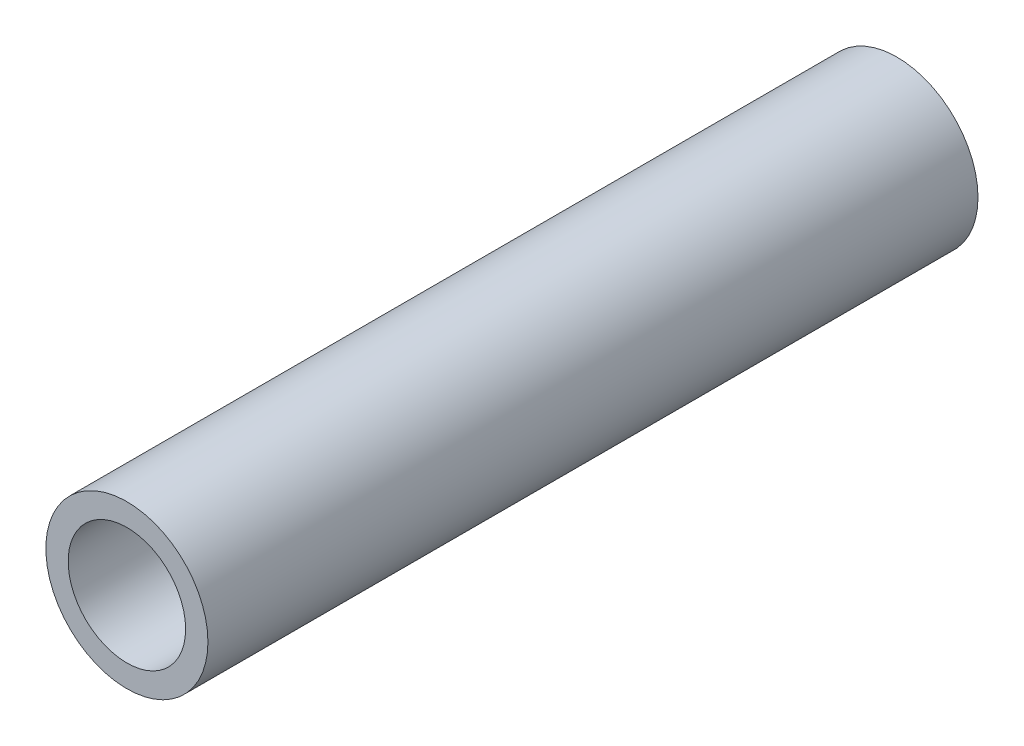
ISO-10303-21;
HEADER;
FILE_DESCRIPTION(('STEP AP214'),'2;1');
FILE_NAME('part.step','',(''),(''),'','','');
FILE_SCHEMA(('AUTOMOTIVE_DESIGN { 1 0 10303 214 1 1 1 1 }'));
ENDSEC;
DATA;
#1=APPLICATION_CONTEXT('core data for automotive mechanical design processes');
#2=APPLICATION_PROTOCOL_DEFINITION('international standard','automotive_design',2000,#1);
#3=PRODUCT_CONTEXT('',#1,'mechanical');
#4=PRODUCT('Part','Part','',(#3));
#5=PRODUCT_RELATED_PRODUCT_CATEGORY('part','',(#4));
#6=PRODUCT_DEFINITION_FORMATION('','',#4);
#7=PRODUCT_DEFINITION_CONTEXT('part definition',#1,'design');
#8=PRODUCT_DEFINITION('design','',#6,#7);
#9=PRODUCT_DEFINITION_SHAPE('','',#8);
#10=(LENGTH_UNIT() NAMED_UNIT(*) SI_UNIT(.MILLI.,.METRE.));
#11=(NAMED_UNIT(*) PLANE_ANGLE_UNIT() SI_UNIT($,.RADIAN.));
#12=(NAMED_UNIT(*) SI_UNIT($,.STERADIAN.) SOLID_ANGLE_UNIT());
#13=UNCERTAINTY_MEASURE_WITH_UNIT(LENGTH_MEASURE(1.E-05),#10,'distance_accuracy_value','');
#14=(GEOMETRIC_REPRESENTATION_CONTEXT(3) GLOBAL_UNCERTAINTY_ASSIGNED_CONTEXT((#13)) GLOBAL_UNIT_ASSIGNED_CONTEXT((#10,
#11,#12)) REPRESENTATION_CONTEXT('',''));
#15=CARTESIAN_POINT('',(0.,0.,0.));
#16=DIRECTION('',(0.,0.,1.));
#17=DIRECTION('',(1.,0.,0.));
#18=AXIS2_PLACEMENT_3D('',#15,#16,#17);
#19=CARTESIAN_POINT('',(0.,0.,101.6));
#20=DIRECTION('',(0.,0.,1.));
#21=DIRECTION('',(1.,0.,0.));
#22=AXIS2_PLACEMENT_3D('',#19,#20,#21);
#23=PLANE('',#22);
#24=CARTESIAN_POINT('',(0.,0.,101.6));
#25=DIRECTION('',(0.,0.,1.));
#26=DIRECTION('',(1.,0.,0.));
#27=AXIS2_PLACEMENT_3D('',#24,#25,#26);
#28=CIRCLE('',#27,10.6934);
#29=CARTESIAN_POINT('',(10.6934,0.,101.6));
#30=VERTEX_POINT('',#29);
#31=EDGE_CURVE('E10',#30,#30,#28,.T.);
#32=ORIENTED_EDGE('',*,*,#31,.T.);
#33=EDGE_LOOP('',(#32));
#34=FACE_BOUND('',#33,.T.);
#35=CARTESIAN_POINT('',(0.,0.,101.6));
#36=DIRECTION('',(0.,0.,1.));
#37=DIRECTION('',(1.,0.,0.));
#38=AXIS2_PLACEMENT_3D('',#35,#36,#37);
#39=CIRCLE('',#38,7.747);
#40=CARTESIAN_POINT('',(7.747,0.,101.6));
#41=VERTEX_POINT('',#40);
#42=EDGE_CURVE('E46',#41,#41,#39,.T.);
#43=ORIENTED_EDGE('',*,*,#42,.F.);
#44=EDGE_LOOP('',(#43));
#45=FACE_BOUND('',#44,.T.);
#46=ADVANCED_FACE('F35',(#34,#45),#23,.T.);
#47=CARTESIAN_POINT('',(0.,0.,0.));
#48=DIRECTION('',(0.,0.,1.));
#49=DIRECTION('',(1.,0.,0.));
#50=AXIS2_PLACEMENT_3D('',#47,#48,#49);
#51=PLANE('',#50);
#52=CARTESIAN_POINT('',(0.,0.,0.));
#53=DIRECTION('',(0.,0.,1.));
#54=DIRECTION('',(1.,0.,0.));
#55=AXIS2_PLACEMENT_3D('',#52,#53,#54);
#56=CIRCLE('',#55,10.6934);
#57=CARTESIAN_POINT('',(10.6934,0.,0.));
#58=VERTEX_POINT('',#57);
#59=EDGE_CURVE('E39',#58,#58,#56,.T.);
#60=ORIENTED_EDGE('',*,*,#59,.F.);
#61=EDGE_LOOP('',(#60));
#62=FACE_BOUND('',#61,.T.);
#63=CARTESIAN_POINT('',(0.,0.,0.));
#64=DIRECTION('',(0.,0.,1.));
#65=DIRECTION('',(1.,0.,0.));
#66=AXIS2_PLACEMENT_3D('',#63,#64,#65);
#67=CIRCLE('',#66,7.747);
#68=CARTESIAN_POINT('',(7.747,0.,0.));
#69=VERTEX_POINT('',#68);
#70=EDGE_CURVE('E48',#69,#69,#67,.T.);
#71=ORIENTED_EDGE('',*,*,#70,.T.);
#72=EDGE_LOOP('',(#71));
#73=FACE_BOUND('',#72,.T.);
#74=ADVANCED_FACE('F58',(#62,#73),#51,.F.);
#75=CARTESIAN_POINT('',(0.,0.,101.6));
#76=DIRECTION('',(0.,0.,-1.));
#77=DIRECTION('',(-1.,0.,0.));
#78=AXIS2_PLACEMENT_3D('',#75,#76,#77);
#79=CYLINDRICAL_SURFACE('',#78,10.6934);
#80=ORIENTED_EDGE('',*,*,#31,.F.);
#81=EDGE_LOOP('',(#80));
#82=FACE_BOUND('',#81,.T.);
#83=ORIENTED_EDGE('',*,*,#59,.T.);
#84=EDGE_LOOP('',(#83));
#85=FACE_BOUND('',#84,.T.);
#86=ADVANCED_FACE('F37',(#82,#85),#79,.T.);
#87=CARTESIAN_POINT('',(0.,0.,101.6));
#88=DIRECTION('',(0.,0.,-1.));
#89=DIRECTION('',(-1.,0.,0.));
#90=AXIS2_PLACEMENT_3D('',#87,#88,#89);
#91=CYLINDRICAL_SURFACE('',#90,7.747);
#92=ORIENTED_EDGE('',*,*,#42,.T.);
#93=EDGE_LOOP('',(#92));
#94=FACE_BOUND('',#93,.T.);
#95=ORIENTED_EDGE('',*,*,#70,.F.);
#96=EDGE_LOOP('',(#95));
#97=FACE_BOUND('',#96,.T.);
#98=ADVANCED_FACE('F54',(#94,#97),#91,.F.);
#99=CLOSED_SHELL('',(#46,#74,#86,#98));
#100=MANIFOLD_SOLID_BREP('B2',#99);
#101=ADVANCED_BREP_SHAPE_REPRESENTATION('',(#18,#100),#14);
#102=SHAPE_DEFINITION_REPRESENTATION(#9,#101);
ENDSEC;
END-ISO-10303-21;
